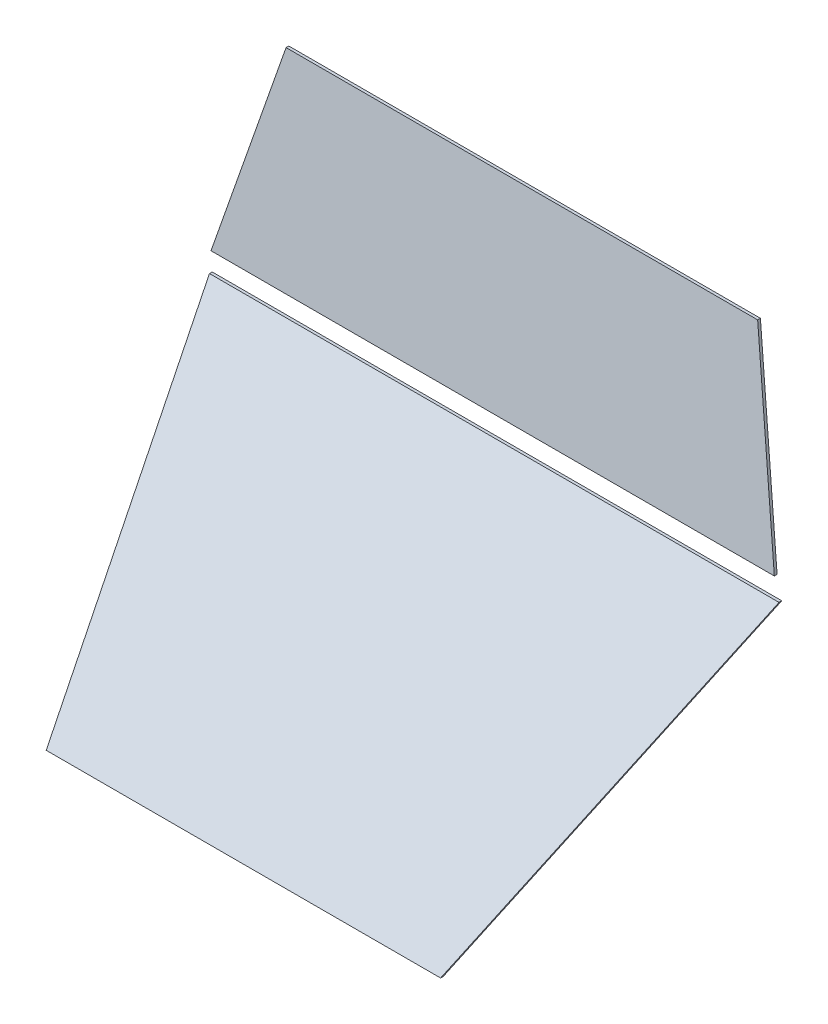
ISO-10303-21;
HEADER;
FILE_DESCRIPTION(('STEP AP214'),'2;1');
FILE_NAME('part.step','',(''),(''),'','','');
FILE_SCHEMA(('AUTOMOTIVE_DESIGN { 1 0 10303 214 1 1 1 1 }'));
ENDSEC;
DATA;
#1=APPLICATION_CONTEXT('core data for automotive mechanical design processes');
#2=APPLICATION_PROTOCOL_DEFINITION('international standard','automotive_design',2000,#1);
#3=PRODUCT_CONTEXT('',#1,'mechanical');
#4=PRODUCT('Part','Part','',(#3));
#5=PRODUCT_RELATED_PRODUCT_CATEGORY('part','',(#4));
#6=PRODUCT_DEFINITION_FORMATION('','',#4);
#7=PRODUCT_DEFINITION_CONTEXT('part definition',#1,'design');
#8=PRODUCT_DEFINITION('design','',#6,#7);
#9=PRODUCT_DEFINITION_SHAPE('','',#8);
#10=(LENGTH_UNIT() NAMED_UNIT(*) SI_UNIT(.MILLI.,.METRE.));
#11=(NAMED_UNIT(*) PLANE_ANGLE_UNIT() SI_UNIT($,.RADIAN.));
#12=(NAMED_UNIT(*) SI_UNIT($,.STERADIAN.) SOLID_ANGLE_UNIT());
#13=UNCERTAINTY_MEASURE_WITH_UNIT(LENGTH_MEASURE(1.E-05),#10,'distance_accuracy_value','');
#14=(GEOMETRIC_REPRESENTATION_CONTEXT(3) GLOBAL_UNCERTAINTY_ASSIGNED_CONTEXT((#13)) GLOBAL_UNIT_ASSIGNED_CONTEXT((#10,
#11,#12)) REPRESENTATION_CONTEXT('',''));
#15=CARTESIAN_POINT('',(0.,0.,0.));
#16=DIRECTION('',(0.,0.,1.));
#17=DIRECTION('',(1.,0.,0.));
#18=AXIS2_PLACEMENT_3D('',#15,#16,#17);
#19=CARTESIAN_POINT('',(0.,-217.067393059986,-1373.50958171903));
#20=DIRECTION('',(0.,-0.156434465040233,-0.987688340595137));
#21=DIRECTION('',(0.,0.987688340595137,-0.156434465040233));
#22=AXIS2_PLACEMENT_3D('',#19,#20,#21);
#23=PLANE('',#22);
#24=DIRECTION('',(-1.,0.,0.));
#25=VECTOR('',#24,1.);
#26=CARTESIAN_POINT('',(256.67940055079,589.639523668316,-1501.27940523098));
#27=LINE('',#26,#25);
#28=CARTESIAN_POINT('',(256.67940055079,589.639523668316,-1501.27940523098));
#29=VERTEX_POINT('',#28);
#30=CARTESIAN_POINT('',(-256.67940055079,589.639523668316,-1501.27940523098));
#31=VERTEX_POINT('',#30);
#32=EDGE_CURVE('E104',#29,#31,#27,.T.);
#33=ORIENTED_EDGE('',*,*,#32,.F.);
#34=DIRECTION('',(0.238718940137513,-0.959132988886851,0.151911741641646));
#35=VECTOR('',#34,1.);
#36=CARTESIAN_POINT('',(256.67940055079,589.639523668316,-1501.27940523098));
#37=LINE('',#36,#35);
#38=CARTESIAN_POINT('',(306.608164129765,389.03405761128,-1469.50662076349));
#39=VERTEX_POINT('',#38);
#40=EDGE_CURVE('E85',#29,#39,#37,.T.);
#41=ORIENTED_EDGE('',*,*,#40,.T.);
#42=DIRECTION('',(-1.,0.,0.));
#43=VECTOR('',#42,1.);
#44=CARTESIAN_POINT('',(306.608164129765,389.03405761128,-1469.50662076349));
#45=LINE('',#44,#43);
#46=CARTESIAN_POINT('',(-306.608164129765,389.03405761128,-1469.50662076349));
#47=VERTEX_POINT('',#46);
#48=EDGE_CURVE('E138',#39,#47,#45,.T.);
#49=ORIENTED_EDGE('',*,*,#48,.T.);
#50=DIRECTION('',(-0.238718940137513,-0.959132988886851,0.151911741641646));
#51=VECTOR('',#50,1.);
#52=CARTESIAN_POINT('',(-256.67940055079,589.639523668316,-1501.27940523098));
#53=LINE('',#52,#51);
#54=EDGE_CURVE('E113',#31,#47,#53,.T.);
#55=ORIENTED_EDGE('',*,*,#54,.F.);
#56=EDGE_LOOP('',(#33,#41,#49,#55));
#57=FACE_BOUND('',#56,.T.);
#58=ADVANCED_FACE('F76',(#57),#23,.T.);
#59=CARTESIAN_POINT('',(0.,-217.067393059986,-1370.50958171903));
#60=DIRECTION('',(0.,-0.156434465040233,-0.987688340595137));
#61=DIRECTION('',(0.,0.987688340595137,-0.156434465040233));
#62=AXIS2_PLACEMENT_3D('',#59,#60,#61);
#63=PLANE('',#62);
#64=DIRECTION('',(-1.,0.,0.));
#65=VECTOR('',#64,1.);
#66=CARTESIAN_POINT('',(256.67940055079,589.639523668316,-1498.27940523098));
#67=LINE('',#66,#65);
#68=CARTESIAN_POINT('',(256.67940055079,589.639523668316,-1498.27940523098));
#69=VERTEX_POINT('',#68);
#70=CARTESIAN_POINT('',(-256.67940055079,589.639523668316,-1498.27940523098));
#71=VERTEX_POINT('',#70);
#72=EDGE_CURVE('E94',#69,#71,#67,.T.);
#73=ORIENTED_EDGE('',*,*,#72,.T.);
#74=DIRECTION('',(-0.238718940137513,-0.959132988886851,0.151911741641646));
#75=VECTOR('',#74,1.);
#76=CARTESIAN_POINT('',(-256.67940055079,589.639523668316,-1498.27940523098));
#77=LINE('',#76,#75);
#78=CARTESIAN_POINT('',(-306.608164129765,389.03405761128,-1466.50662076349));
#79=VERTEX_POINT('',#78);
#80=EDGE_CURVE('E133',#71,#79,#77,.T.);
#81=ORIENTED_EDGE('',*,*,#80,.T.);
#82=DIRECTION('',(-1.,0.,0.));
#83=VECTOR('',#82,1.);
#84=CARTESIAN_POINT('',(306.608164129765,389.03405761128,-1466.50662076349));
#85=LINE('',#84,#83);
#86=CARTESIAN_POINT('',(306.608164129765,389.03405761128,-1466.50662076349));
#87=VERTEX_POINT('',#86);
#88=EDGE_CURVE('E131',#87,#79,#85,.T.);
#89=ORIENTED_EDGE('',*,*,#88,.F.);
#90=DIRECTION('',(0.238718940137513,-0.959132988886851,0.151911741641646));
#91=VECTOR('',#90,1.);
#92=CARTESIAN_POINT('',(256.67940055079,589.639523668316,-1498.27940523098));
#93=LINE('',#92,#91);
#94=EDGE_CURVE('E13',#69,#87,#93,.T.);
#95=ORIENTED_EDGE('',*,*,#94,.F.);
#96=EDGE_LOOP('',(#73,#81,#89,#95));
#97=FACE_BOUND('',#96,.T.);
#98=ADVANCED_FACE('F132',(#97),#63,.F.);
#99=CARTESIAN_POINT('',(256.67940055079,589.639523668316,-1498.27940523098));
#100=DIRECTION('',(0.,-1.,0.));
#101=DIRECTION('',(0.,0.,-1.));
#102=AXIS2_PLACEMENT_3D('',#99,#100,#101);
#103=PLANE('',#102);
#104=ORIENTED_EDGE('',*,*,#32,.T.);
#105=DIRECTION('',(0.,0.,-1.));
#106=VECTOR('',#105,1.);
#107=CARTESIAN_POINT('',(-256.67940055079,589.639523668316,-1498.27940523098));
#108=LINE('',#107,#106);
#109=EDGE_CURVE('E162',#71,#31,#108,.T.);
#110=ORIENTED_EDGE('',*,*,#109,.F.);
#111=ORIENTED_EDGE('',*,*,#72,.F.);
#112=DIRECTION('',(0.,0.,-1.));
#113=VECTOR('',#112,1.);
#114=CARTESIAN_POINT('',(256.67940055079,589.639523668316,-1498.27940523098));
#115=LINE('',#114,#113);
#116=EDGE_CURVE('E128',#69,#29,#115,.T.);
#117=ORIENTED_EDGE('',*,*,#116,.T.);
#118=EDGE_LOOP('',(#104,#110,#111,#117));
#119=FACE_BOUND('',#118,.T.);
#120=ADVANCED_FACE('F172',(#119),#103,.F.);
#121=CARTESIAN_POINT('',(-256.67940055079,589.639523668316,-1498.27940523098));
#122=DIRECTION('',(0.970395336529522,-0.241522029723493,0.));
#123=DIRECTION('',(0.241522029723493,0.970395336529522,0.));
#124=AXIS2_PLACEMENT_3D('',#121,#122,#123);
#125=PLANE('',#124);
#126=ORIENTED_EDGE('',*,*,#54,.T.);
#127=DIRECTION('',(0.,0.,-1.));
#128=VECTOR('',#127,1.);
#129=CARTESIAN_POINT('',(-306.608164129765,389.03405761128,-1466.50662076349));
#130=LINE('',#129,#128);
#131=EDGE_CURVE('E140',#79,#47,#130,.T.);
#132=ORIENTED_EDGE('',*,*,#131,.F.);
#133=ORIENTED_EDGE('',*,*,#80,.F.);
#134=ORIENTED_EDGE('',*,*,#109,.T.);
#135=EDGE_LOOP('',(#126,#132,#133,#134));
#136=FACE_BOUND('',#135,.T.);
#137=ADVANCED_FACE('F183',(#136),#125,.F.);
#138=CARTESIAN_POINT('',(256.67940055079,589.639523668316,-1498.27940523098));
#139=DIRECTION('',(0.970395336529522,0.241522029723493,0.));
#140=DIRECTION('',(-0.241522029723493,0.970395336529522,0.));
#141=AXIS2_PLACEMENT_3D('',#138,#139,#140);
#142=PLANE('',#141);
#143=ORIENTED_EDGE('',*,*,#40,.F.);
#144=ORIENTED_EDGE('',*,*,#116,.F.);
#145=ORIENTED_EDGE('',*,*,#94,.T.);
#146=DIRECTION('',(0.,0.,-1.));
#147=VECTOR('',#146,1.);
#148=CARTESIAN_POINT('',(306.608164129765,389.03405761128,-1466.50662076349));
#149=LINE('',#148,#147);
#150=EDGE_CURVE('E126',#87,#39,#149,.T.);
#151=ORIENTED_EDGE('',*,*,#150,.T.);
#152=EDGE_LOOP('',(#143,#144,#145,#151));
#153=FACE_BOUND('',#152,.T.);
#154=ADVANCED_FACE('F124',(#153),#142,.T.);
#155=CARTESIAN_POINT('',(306.608164129765,389.03405761128,-1466.50662076349));
#156=DIRECTION('',(0.,-1.,0.));
#157=DIRECTION('',(0.,0.,-1.));
#158=AXIS2_PLACEMENT_3D('',#155,#156,#157);
#159=PLANE('',#158);
#160=ORIENTED_EDGE('',*,*,#48,.F.);
#161=ORIENTED_EDGE('',*,*,#150,.F.);
#162=ORIENTED_EDGE('',*,*,#88,.T.);
#163=ORIENTED_EDGE('',*,*,#131,.T.);
#164=EDGE_LOOP('',(#160,#161,#162,#163));
#165=FACE_BOUND('',#164,.T.);
#166=ADVANCED_FACE('F136',(#165),#159,.T.);
#167=CLOSED_SHELL('',(#58,#98,#120,#137,#154,#166));
#168=MANIFOLD_SOLID_BREP('B2',#167);
#169=CARTESIAN_POINT('',(400000.,-202813.18390479,207683.523335499));
#170=DIRECTION('',(0.,-0.717280608106448,-0.696784420918296));
#171=DIRECTION('',(0.,0.696784420918296,-0.717280608106448));
#172=AXIS2_PLACEMENT_3D('',#169,#170,#171);
#173=PLANE('',#172);
#174=DIRECTION('',(0.242976204497678,-0.675903358872827,0.695785321426324));
#175=VECTOR('',#174,1.);
#176=CARTESIAN_POINT('',(92050.4614043485,-256560.348798259,263011.682176906));
#177=LINE('',#176,#175);
#178=CARTESIAN_POINT('',(-310.000000000002,365.000000000009,-1471.22658431898));
#179=VERTEX_POINT('',#178);
#180=CARTESIAN_POINT('',(-214.645533975386,99.7460258391527,-1198.1700604116));
#181=VERTEX_POINT('',#180);
#182=EDGE_CURVE('E233',#179,#181,#177,.T.);
#183=ORIENTED_EDGE('',*,*,#182,.F.);
#184=DIRECTION('',(1.,0.,0.));
#185=VECTOR('',#184,1.);
#186=CARTESIAN_POINT('',(400000.,365.000000000009,-1471.22658431898));
#187=LINE('',#186,#185);
#188=CARTESIAN_POINT('',(310.000000000002,365.000000000009,-1471.22658431898));
#189=VERTEX_POINT('',#188);
#190=EDGE_CURVE('E285',#179,#189,#187,.T.);
#191=ORIENTED_EDGE('',*,*,#190,.T.);
#192=DIRECTION('',(-0.242976204497678,-0.675903358872827,0.695785321426324));
#193=VECTOR('',#192,1.);
#194=CARTESIAN_POINT('',(-44820.5126426704,-125177.602601338,127764.260940614));
#195=LINE('',#194,#193);
#196=CARTESIAN_POINT('',(214.645533975446,99.7460258392167,-1198.17006041166));
#197=VERTEX_POINT('',#196);
#198=EDGE_CURVE('E256',#189,#197,#195,.T.);
#199=ORIENTED_EDGE('',*,*,#198,.T.);
#200=DIRECTION('',(-1.,0.,0.));
#201=VECTOR('',#200,1.);
#202=CARTESIAN_POINT('',(400000.,99.7460258391243,-1198.17006041158));
#203=LINE('',#202,#201);
#204=EDGE_CURVE('E260',#197,#181,#203,.T.);
#205=ORIENTED_EDGE('',*,*,#204,.T.);
#206=EDGE_LOOP('',(#183,#191,#199,#205));
#207=FACE_BOUND('',#206,.T.);
#208=ADVANCED_FACE('F224',(#207),#173,.T.);
#209=CARTESIAN_POINT('',(400000.,-202813.18390479,207686.523335499));
#210=DIRECTION('',(0.,-0.717280608106448,-0.696784420918296));
#211=DIRECTION('',(0.,0.696784420918296,-0.717280608106448));
#212=AXIS2_PLACEMENT_3D('',#209,#210,#211);
#213=PLANE('',#212);
#214=DIRECTION('',(0.242976204497678,-0.675903358872827,0.695785321426324));
#215=VECTOR('',#214,1.);
#216=CARTESIAN_POINT('',(92050.4614043485,-256560.348798259,263014.682176906));
#217=LINE('',#216,#215);
#218=CARTESIAN_POINT('',(-310.000000000002,365.000000000009,-1468.22658431898));
#219=VERTEX_POINT('',#218);
#220=CARTESIAN_POINT('',(-214.645533975386,99.7460258391527,-1195.1700604116));
#221=VERTEX_POINT('',#220);
#222=EDGE_CURVE('E74',#219,#221,#217,.T.);
#223=ORIENTED_EDGE('',*,*,#222,.T.);
#224=DIRECTION('',(-1.,0.,0.));
#225=VECTOR('',#224,1.);
#226=CARTESIAN_POINT('',(400000.,99.7460258391243,-1195.17006041158));
#227=LINE('',#226,#225);
#228=CARTESIAN_POINT('',(214.645533975446,99.7460258392167,-1195.17006041166));
#229=VERTEX_POINT('',#228);
#230=EDGE_CURVE('E272',#229,#221,#227,.T.);
#231=ORIENTED_EDGE('',*,*,#230,.F.);
#232=DIRECTION('',(-0.242976204497678,-0.675903358872827,0.695785321426324));
#233=VECTOR('',#232,1.);
#234=CARTESIAN_POINT('',(-44820.5126426704,-125177.602601338,127767.260940614));
#235=LINE('',#234,#233);
#236=CARTESIAN_POINT('',(310.000000000002,365.000000000009,-1468.22658431898));
#237=VERTEX_POINT('',#236);
#238=EDGE_CURVE('E268',#237,#229,#235,.T.);
#239=ORIENTED_EDGE('',*,*,#238,.F.);
#240=DIRECTION('',(1.,0.,0.));
#241=VECTOR('',#240,1.);
#242=CARTESIAN_POINT('',(400000.,365.000000000009,-1468.22658431898));
#243=LINE('',#242,#241);
#244=EDGE_CURVE('E265',#219,#237,#243,.T.);
#245=ORIENTED_EDGE('',*,*,#244,.F.);
#246=EDGE_LOOP('',(#223,#231,#239,#245));
#247=FACE_BOUND('',#246,.T.);
#248=ADVANCED_FACE('F270',(#247),#213,.F.);
#249=CARTESIAN_POINT('',(400000.,365.000000000009,-1468.22658431898));
#250=DIRECTION('',(0.,1.,0.));
#251=DIRECTION('',(0.,0.,1.));
#252=AXIS2_PLACEMENT_3D('',#249,#250,#251);
#253=PLANE('',#252);
#254=ORIENTED_EDGE('',*,*,#190,.F.);
#255=DIRECTION('',(0.,0.,-1.));
#256=VECTOR('',#255,1.);
#257=CARTESIAN_POINT('',(-310.000000000002,365.000000000009,-1468.22658431898));
#258=LINE('',#257,#256);
#259=EDGE_CURVE('E227',#219,#179,#258,.T.);
#260=ORIENTED_EDGE('',*,*,#259,.F.);
#261=ORIENTED_EDGE('',*,*,#244,.T.);
#262=DIRECTION('',(0.,0.,-1.));
#263=VECTOR('',#262,1.);
#264=CARTESIAN_POINT('',(310.000000000002,365.000000000009,-1468.22658431898));
#265=LINE('',#264,#263);
#266=EDGE_CURVE('E278',#237,#189,#265,.T.);
#267=ORIENTED_EDGE('',*,*,#266,.T.);
#268=EDGE_LOOP('',(#254,#260,#261,#267));
#269=FACE_BOUND('',#268,.T.);
#270=ADVANCED_FACE('F282',(#269),#253,.T.);
#271=CARTESIAN_POINT('',(-44820.5126426704,-125177.602601338,127767.260940614));
#272=DIRECTION('',(0.941042171509649,-0.338289271837587,0.));
#273=DIRECTION('',(0.338289271837587,0.941042171509649,0.));
#274=AXIS2_PLACEMENT_3D('',#271,#272,#273);
#275=PLANE('',#274);
#276=ORIENTED_EDGE('',*,*,#198,.F.);
#277=ORIENTED_EDGE('',*,*,#266,.F.);
#278=ORIENTED_EDGE('',*,*,#238,.T.);
#279=DIRECTION('',(0.,0.,-1.));
#280=VECTOR('',#279,1.);
#281=CARTESIAN_POINT('',(214.64553397545,99.7460258391953,-1195.17006041163));
#282=LINE('',#281,#280);
#283=EDGE_CURVE('E275',#229,#197,#282,.T.);
#284=ORIENTED_EDGE('',*,*,#283,.T.);
#285=EDGE_LOOP('',(#276,#277,#278,#284));
#286=FACE_BOUND('',#285,.T.);
#287=ADVANCED_FACE('F279',(#286),#275,.T.);
#288=CARTESIAN_POINT('',(400000.,99.7460258391243,-1195.17006041158));
#289=DIRECTION('',(0.,-1.,0.));
#290=DIRECTION('',(0.,0.,-1.));
#291=AXIS2_PLACEMENT_3D('',#288,#289,#290);
#292=PLANE('',#291);
#293=ORIENTED_EDGE('',*,*,#204,.F.);
#294=ORIENTED_EDGE('',*,*,#283,.F.);
#295=ORIENTED_EDGE('',*,*,#230,.T.);
#296=DIRECTION('',(0.,0.,-1.));
#297=VECTOR('',#296,1.);
#298=CARTESIAN_POINT('',(-214.645533975386,99.7460258391243,-1195.17006041158));
#299=LINE('',#298,#297);
#300=EDGE_CURVE('E287',#221,#181,#299,.T.);
#301=ORIENTED_EDGE('',*,*,#300,.T.);
#302=EDGE_LOOP('',(#293,#294,#295,#301));
#303=FACE_BOUND('',#302,.T.);
#304=ADVANCED_FACE('F296',(#303),#292,.T.);
#305=CARTESIAN_POINT('',(92050.4614043485,-256560.348798259,263014.682176906));
#306=DIRECTION('',(0.941042171509649,0.338289271837587,0.));
#307=DIRECTION('',(-0.338289271837587,0.941042171509649,0.));
#308=AXIS2_PLACEMENT_3D('',#305,#306,#307);
#309=PLANE('',#308);
#310=ORIENTED_EDGE('',*,*,#182,.T.);
#311=ORIENTED_EDGE('',*,*,#300,.F.);
#312=ORIENTED_EDGE('',*,*,#222,.F.);
#313=ORIENTED_EDGE('',*,*,#259,.T.);
#314=EDGE_LOOP('',(#310,#311,#312,#313));
#315=FACE_BOUND('',#314,.T.);
#316=ADVANCED_FACE('F298',(#315),#309,.F.);
#317=CLOSED_SHELL('',(#208,#248,#270,#287,#304,#316));
#318=MANIFOLD_SOLID_BREP('B7',#317);
#319=ADVANCED_BREP_SHAPE_REPRESENTATION('',(#18,#168,#318),#14);
#320=SHAPE_DEFINITION_REPRESENTATION(#9,#319);
ENDSEC;
END-ISO-10303-21;
